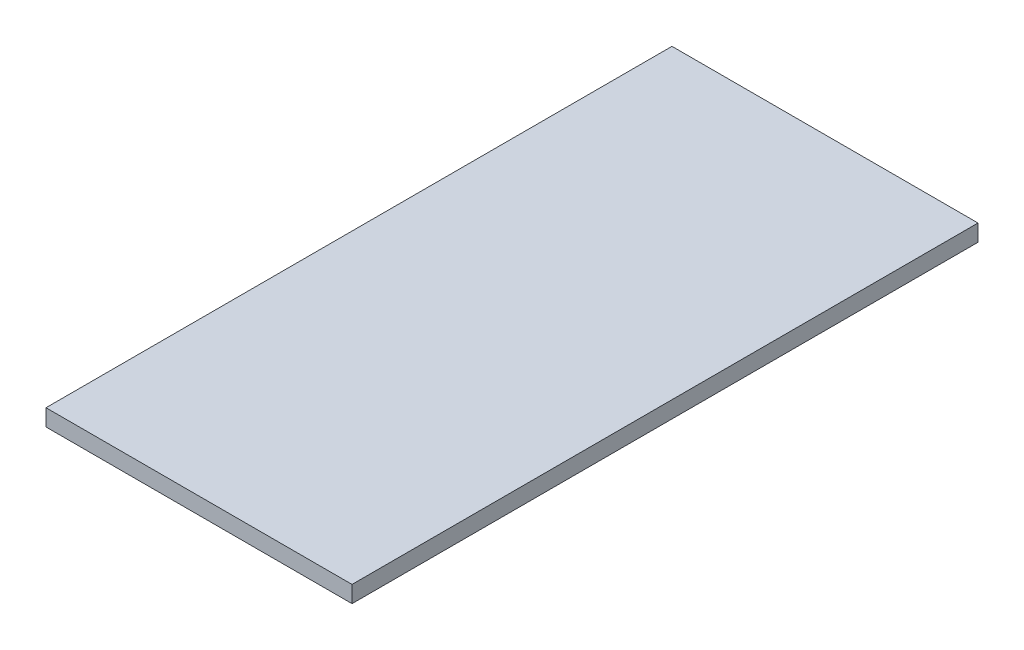
ISO-10303-21;
HEADER;
FILE_DESCRIPTION(('STEP AP214'),'2;1');
FILE_NAME('part.step','',(''),(''),'','','');
FILE_SCHEMA(('AUTOMOTIVE_DESIGN { 1 0 10303 214 1 1 1 1 }'));
ENDSEC;
DATA;
#1=APPLICATION_CONTEXT('core data for automotive mechanical design processes');
#2=APPLICATION_PROTOCOL_DEFINITION('international standard','automotive_design',2000,#1);
#3=PRODUCT_CONTEXT('',#1,'mechanical');
#4=PRODUCT('Part','Part','',(#3));
#5=PRODUCT_RELATED_PRODUCT_CATEGORY('part','',(#4));
#6=PRODUCT_DEFINITION_FORMATION('','',#4);
#7=PRODUCT_DEFINITION_CONTEXT('part definition',#1,'design');
#8=PRODUCT_DEFINITION('design','',#6,#7);
#9=PRODUCT_DEFINITION_SHAPE('','',#8);
#10=(LENGTH_UNIT() NAMED_UNIT(*) SI_UNIT(.MILLI.,.METRE.));
#11=(NAMED_UNIT(*) PLANE_ANGLE_UNIT() SI_UNIT($,.RADIAN.));
#12=(NAMED_UNIT(*) SI_UNIT($,.STERADIAN.) SOLID_ANGLE_UNIT());
#13=UNCERTAINTY_MEASURE_WITH_UNIT(LENGTH_MEASURE(1.E-05),#10,'distance_accuracy_value','');
#14=(GEOMETRIC_REPRESENTATION_CONTEXT(3) GLOBAL_UNCERTAINTY_ASSIGNED_CONTEXT((#13)) GLOBAL_UNIT_ASSIGNED_CONTEXT((#10,
#11,#12)) REPRESENTATION_CONTEXT('',''));
#15=CARTESIAN_POINT('',(0.,0.,0.));
#16=DIRECTION('',(0.,0.,1.));
#17=DIRECTION('',(1.,0.,0.));
#18=AXIS2_PLACEMENT_3D('',#15,#16,#17);
#19=CARTESIAN_POINT('',(11.,1.2,-22.5));
#20=DIRECTION('',(-1.,0.,0.));
#21=DIRECTION('',(0.,0.,1.));
#22=AXIS2_PLACEMENT_3D('',#19,#20,#21);
#23=PLANE('',#22);
#24=DIRECTION('',(0.,0.,-1.));
#25=VECTOR('',#24,1.);
#26=CARTESIAN_POINT('',(11.,0.,-22.5));
#27=LINE('',#26,#25);
#28=CARTESIAN_POINT('',(11.,0.,22.5));
#29=VERTEX_POINT('',#28);
#30=CARTESIAN_POINT('',(11.,0.,-22.5));
#31=VERTEX_POINT('',#30);
#32=EDGE_CURVE('E107',#29,#31,#27,.T.);
#33=ORIENTED_EDGE('',*,*,#32,.T.);
#34=DIRECTION('',(0.,-1.,0.));
#35=VECTOR('',#34,1.);
#36=CARTESIAN_POINT('',(11.,1.2,-22.5));
#37=LINE('',#36,#35);
#38=CARTESIAN_POINT('',(11.,1.2,-22.5));
#39=VERTEX_POINT('',#38);
#40=EDGE_CURVE('E11',#39,#31,#37,.T.);
#41=ORIENTED_EDGE('',*,*,#40,.F.);
#42=DIRECTION('',(0.,0.,-1.));
#43=VECTOR('',#42,1.);
#44=CARTESIAN_POINT('',(11.,1.2,-22.5));
#45=LINE('',#44,#43);
#46=CARTESIAN_POINT('',(11.,1.2,22.5));
#47=VERTEX_POINT('',#46);
#48=EDGE_CURVE('E91',#47,#39,#45,.T.);
#49=ORIENTED_EDGE('',*,*,#48,.F.);
#50=DIRECTION('',(0.,-1.,0.));
#51=VECTOR('',#50,1.);
#52=CARTESIAN_POINT('',(11.,1.2,22.5));
#53=LINE('',#52,#51);
#54=EDGE_CURVE('E103',#47,#29,#53,.T.);
#55=ORIENTED_EDGE('',*,*,#54,.T.);
#56=EDGE_LOOP('',(#33,#41,#49,#55));
#57=FACE_BOUND('',#56,.T.);
#58=ADVANCED_FACE('F39',(#57),#23,.F.);
#59=CARTESIAN_POINT('',(-11.,1.2,-22.5));
#60=DIRECTION('',(0.,0.,1.));
#61=DIRECTION('',(1.,0.,0.));
#62=AXIS2_PLACEMENT_3D('',#59,#60,#61);
#63=PLANE('',#62);
#64=DIRECTION('',(-1.,0.,0.));
#65=VECTOR('',#64,1.);
#66=CARTESIAN_POINT('',(-11.,0.,-22.5));
#67=LINE('',#66,#65);
#68=CARTESIAN_POINT('',(-11.,0.,-22.5));
#69=VERTEX_POINT('',#68);
#70=EDGE_CURVE('E96',#31,#69,#67,.T.);
#71=ORIENTED_EDGE('',*,*,#70,.T.);
#72=DIRECTION('',(0.,-1.,0.));
#73=VECTOR('',#72,1.);
#74=CARTESIAN_POINT('',(-11.,1.2,-22.5));
#75=LINE('',#74,#73);
#76=CARTESIAN_POINT('',(-11.,1.2,-22.5));
#77=VERTEX_POINT('',#76);
#78=EDGE_CURVE('E48',#77,#69,#75,.T.);
#79=ORIENTED_EDGE('',*,*,#78,.F.);
#80=DIRECTION('',(-1.,0.,0.));
#81=VECTOR('',#80,1.);
#82=CARTESIAN_POINT('',(-11.,1.2,-22.5));
#83=LINE('',#82,#81);
#84=EDGE_CURVE('E86',#39,#77,#83,.T.);
#85=ORIENTED_EDGE('',*,*,#84,.F.);
#86=ORIENTED_EDGE('',*,*,#40,.T.);
#87=EDGE_LOOP('',(#71,#79,#85,#86));
#88=FACE_BOUND('',#87,.T.);
#89=ADVANCED_FACE('F95',(#88),#63,.F.);
#90=CARTESIAN_POINT('',(-11.,1.2,-22.5));
#91=DIRECTION('',(1.,0.,0.));
#92=DIRECTION('',(0.,0.,-1.));
#93=AXIS2_PLACEMENT_3D('',#90,#91,#92);
#94=PLANE('',#93);
#95=DIRECTION('',(0.,0.,1.));
#96=VECTOR('',#95,1.);
#97=CARTESIAN_POINT('',(-11.,0.,-22.5));
#98=LINE('',#97,#96);
#99=CARTESIAN_POINT('',(-11.,0.,22.5));
#100=VERTEX_POINT('',#99);
#101=EDGE_CURVE('E73',#69,#100,#98,.T.);
#102=ORIENTED_EDGE('',*,*,#101,.T.);
#103=DIRECTION('',(0.,-1.,0.));
#104=VECTOR('',#103,1.);
#105=CARTESIAN_POINT('',(-11.,1.2,22.5));
#106=LINE('',#105,#104);
#107=CARTESIAN_POINT('',(-11.,1.2,22.5));
#108=VERTEX_POINT('',#107);
#109=EDGE_CURVE('E98',#108,#100,#106,.T.);
#110=ORIENTED_EDGE('',*,*,#109,.F.);
#111=DIRECTION('',(0.,0.,1.));
#112=VECTOR('',#111,1.);
#113=CARTESIAN_POINT('',(-11.,1.2,-22.5));
#114=LINE('',#113,#112);
#115=EDGE_CURVE('E89',#77,#108,#114,.T.);
#116=ORIENTED_EDGE('',*,*,#115,.F.);
#117=ORIENTED_EDGE('',*,*,#78,.T.);
#118=EDGE_LOOP('',(#102,#110,#116,#117));
#119=FACE_BOUND('',#118,.T.);
#120=ADVANCED_FACE('F99',(#119),#94,.F.);
#121=CARTESIAN_POINT('',(-11.,1.2,22.5));
#122=DIRECTION('',(0.,0.,-1.));
#123=DIRECTION('',(-1.,0.,0.));
#124=AXIS2_PLACEMENT_3D('',#121,#122,#123);
#125=PLANE('',#124);
#126=DIRECTION('',(1.,0.,0.));
#127=VECTOR('',#126,1.);
#128=CARTESIAN_POINT('',(-11.,0.,22.5));
#129=LINE('',#128,#127);
#130=EDGE_CURVE('E79',#100,#29,#129,.T.);
#131=ORIENTED_EDGE('',*,*,#130,.T.);
#132=ORIENTED_EDGE('',*,*,#54,.F.);
#133=DIRECTION('',(1.,0.,0.));
#134=VECTOR('',#133,1.);
#135=CARTESIAN_POINT('',(-11.,1.2,22.5));
#136=LINE('',#135,#134);
#137=EDGE_CURVE('E56',#108,#47,#136,.T.);
#138=ORIENTED_EDGE('',*,*,#137,.F.);
#139=ORIENTED_EDGE('',*,*,#109,.T.);
#140=EDGE_LOOP('',(#131,#132,#138,#139));
#141=FACE_BOUND('',#140,.T.);
#142=ADVANCED_FACE('F120',(#141),#125,.F.);
#143=CARTESIAN_POINT('',(0.,1.2,0.));
#144=DIRECTION('',(0.,1.,0.));
#145=DIRECTION('',(0.,0.,1.));
#146=AXIS2_PLACEMENT_3D('',#143,#144,#145);
#147=PLANE('',#146);
#148=ORIENTED_EDGE('',*,*,#48,.T.);
#149=ORIENTED_EDGE('',*,*,#84,.T.);
#150=ORIENTED_EDGE('',*,*,#115,.T.);
#151=ORIENTED_EDGE('',*,*,#137,.T.);
#152=EDGE_LOOP('',(#148,#149,#150,#151));
#153=FACE_BOUND('',#152,.T.);
#154=ADVANCED_FACE('F87',(#153),#147,.T.);
#155=CARTESIAN_POINT('',(0.,0.,0.));
#156=DIRECTION('',(0.,1.,0.));
#157=DIRECTION('',(0.,0.,1.));
#158=AXIS2_PLACEMENT_3D('',#155,#156,#157);
#159=PLANE('',#158);
#160=ORIENTED_EDGE('',*,*,#32,.F.);
#161=ORIENTED_EDGE('',*,*,#130,.F.);
#162=ORIENTED_EDGE('',*,*,#101,.F.);
#163=ORIENTED_EDGE('',*,*,#70,.F.);
#164=EDGE_LOOP('',(#160,#161,#162,#163));
#165=FACE_BOUND('',#164,.T.);
#166=ADVANCED_FACE('F123',(#165),#159,.F.);
#167=CLOSED_SHELL('',(#58,#89,#120,#142,#154,#166));
#168=MANIFOLD_SOLID_BREP('B2',#167);
#169=ADVANCED_BREP_SHAPE_REPRESENTATION('',(#18,#168),#14);
#170=SHAPE_DEFINITION_REPRESENTATION(#9,#169);
ENDSEC;
END-ISO-10303-21;
